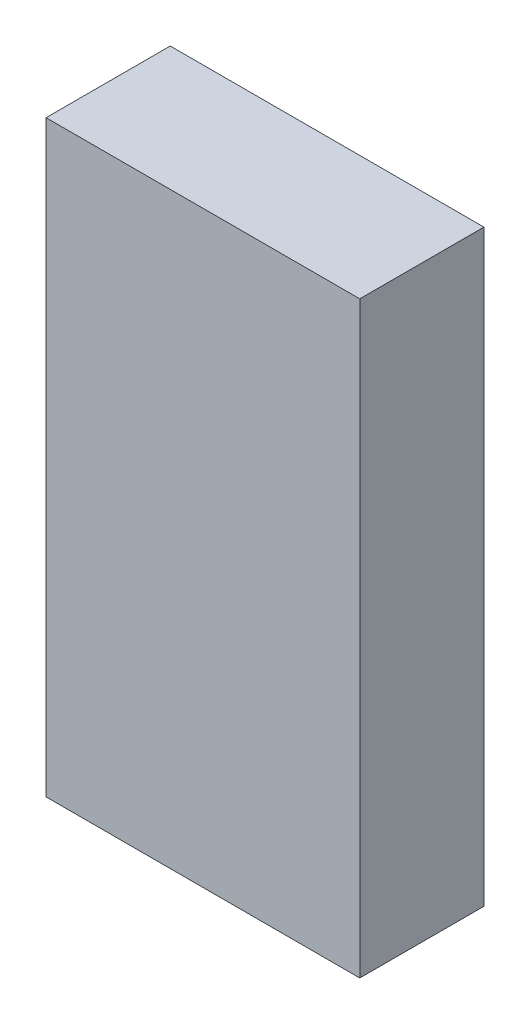
ISO-10303-21;
HEADER;
FILE_DESCRIPTION(('STEP AP214'),'2;1');
FILE_NAME('part.step','',(''),(''),'','','');
FILE_SCHEMA(('AUTOMOTIVE_DESIGN { 1 0 10303 214 1 1 1 1 }'));
ENDSEC;
DATA;
#1=APPLICATION_CONTEXT('core data for automotive mechanical design processes');
#2=APPLICATION_PROTOCOL_DEFINITION('international standard','automotive_design',2000,#1);
#3=PRODUCT_CONTEXT('',#1,'mechanical');
#4=PRODUCT('Part','Part','',(#3));
#5=PRODUCT_RELATED_PRODUCT_CATEGORY('part','',(#4));
#6=PRODUCT_DEFINITION_FORMATION('','',#4);
#7=PRODUCT_DEFINITION_CONTEXT('part definition',#1,'design');
#8=PRODUCT_DEFINITION('design','',#6,#7);
#9=PRODUCT_DEFINITION_SHAPE('','',#8);
#10=(LENGTH_UNIT() NAMED_UNIT(*) SI_UNIT(.MILLI.,.METRE.));
#11=(NAMED_UNIT(*) PLANE_ANGLE_UNIT() SI_UNIT($,.RADIAN.));
#12=(NAMED_UNIT(*) SI_UNIT($,.STERADIAN.) SOLID_ANGLE_UNIT());
#13=UNCERTAINTY_MEASURE_WITH_UNIT(LENGTH_MEASURE(1.E-05),#10,'distance_accuracy_value','');
#14=(GEOMETRIC_REPRESENTATION_CONTEXT(3) GLOBAL_UNCERTAINTY_ASSIGNED_CONTEXT((#13)) GLOBAL_UNIT_ASSIGNED_CONTEXT((#10,
#11,#12)) REPRESENTATION_CONTEXT('',''));
#15=CARTESIAN_POINT('',(0.,0.,0.));
#16=DIRECTION('',(0.,0.,1.));
#17=DIRECTION('',(1.,0.,0.));
#18=AXIS2_PLACEMENT_3D('',#15,#16,#17);
#19=CARTESIAN_POINT('',(0.6096,1.143,0.4826));
#20=DIRECTION('',(0.,0.,-1.));
#21=DIRECTION('',(0.,-1.,0.));
#22=AXIS2_PLACEMENT_3D('',#19,#20,#21);
#23=PLANE('',#22);
#24=DIRECTION('',(-1.,0.,0.));
#25=VECTOR('',#24,1.);
#26=CARTESIAN_POINT('',(0.6096,1.143,0.4826));
#27=LINE('',#26,#25);
#28=CARTESIAN_POINT('',(0.6096,1.143,0.4826));
#29=VERTEX_POINT('',#28);
#30=CARTESIAN_POINT('',(-0.6096,1.143,0.4826));
#31=VERTEX_POINT('',#30);
#32=EDGE_CURVE('E86',#29,#31,#27,.T.);
#33=ORIENTED_EDGE('',*,*,#32,.T.);
#34=DIRECTION('',(0.,-1.,0.));
#35=VECTOR('',#34,1.);
#36=CARTESIAN_POINT('',(-0.6096,1.143,0.4826));
#37=LINE('',#36,#35);
#38=CARTESIAN_POINT('',(-0.6096,-1.143,0.4826));
#39=VERTEX_POINT('',#38);
#40=EDGE_CURVE('E19',#31,#39,#37,.T.);
#41=ORIENTED_EDGE('',*,*,#40,.T.);
#42=DIRECTION('',(1.,0.,0.));
#43=VECTOR('',#42,1.);
#44=CARTESIAN_POINT('',(-0.6096,-1.143,0.4826));
#45=LINE('',#44,#43);
#46=CARTESIAN_POINT('',(0.6096,-1.143,0.4826));
#47=VERTEX_POINT('',#46);
#48=EDGE_CURVE('E102',#39,#47,#45,.T.);
#49=ORIENTED_EDGE('',*,*,#48,.T.);
#50=DIRECTION('',(0.,1.,0.));
#51=VECTOR('',#50,1.);
#52=CARTESIAN_POINT('',(0.6096,-1.143,0.4826));
#53=LINE('',#52,#51);
#54=EDGE_CURVE('E11',#47,#29,#53,.T.);
#55=ORIENTED_EDGE('',*,*,#54,.T.);
#56=EDGE_LOOP('',(#33,#41,#49,#55));
#57=FACE_BOUND('',#56,.T.);
#58=ADVANCED_FACE('F16',(#57),#23,.F.);
#59=CARTESIAN_POINT('',(0.6096,1.143,0.));
#60=DIRECTION('',(0.,0.,-1.));
#61=DIRECTION('',(0.,-1.,0.));
#62=AXIS2_PLACEMENT_3D('',#59,#60,#61);
#63=PLANE('',#62);
#64=DIRECTION('',(0.,1.,0.));
#65=VECTOR('',#64,1.);
#66=CARTESIAN_POINT('',(0.6096,-1.143,0.));
#67=LINE('',#66,#65);
#68=CARTESIAN_POINT('',(0.6096,-1.143,0.));
#69=VERTEX_POINT('',#68);
#70=CARTESIAN_POINT('',(0.6096,1.143,0.));
#71=VERTEX_POINT('',#70);
#72=EDGE_CURVE('E26',#69,#71,#67,.T.);
#73=ORIENTED_EDGE('',*,*,#72,.F.);
#74=DIRECTION('',(1.,0.,0.));
#75=VECTOR('',#74,1.);
#76=CARTESIAN_POINT('',(-0.6096,-1.143,0.));
#77=LINE('',#76,#75);
#78=CARTESIAN_POINT('',(-0.6096,-1.143,0.));
#79=VERTEX_POINT('',#78);
#80=EDGE_CURVE('E70',#79,#69,#77,.T.);
#81=ORIENTED_EDGE('',*,*,#80,.F.);
#82=DIRECTION('',(0.,-1.,0.));
#83=VECTOR('',#82,1.);
#84=CARTESIAN_POINT('',(-0.6096,1.143,0.));
#85=LINE('',#84,#83);
#86=CARTESIAN_POINT('',(-0.6096,1.143,0.));
#87=VERTEX_POINT('',#86);
#88=EDGE_CURVE('E64',#87,#79,#85,.T.);
#89=ORIENTED_EDGE('',*,*,#88,.F.);
#90=DIRECTION('',(-1.,0.,0.));
#91=VECTOR('',#90,1.);
#92=CARTESIAN_POINT('',(0.6096,1.143,0.));
#93=LINE('',#92,#91);
#94=EDGE_CURVE('E68',#71,#87,#93,.T.);
#95=ORIENTED_EDGE('',*,*,#94,.F.);
#96=EDGE_LOOP('',(#73,#81,#89,#95));
#97=FACE_BOUND('',#96,.T.);
#98=ADVANCED_FACE('F66',(#97),#63,.T.);
#99=CARTESIAN_POINT('',(0.6096,-1.143,0.));
#100=DIRECTION('',(-1.,0.,0.));
#101=DIRECTION('',(0.,0.,1.));
#102=AXIS2_PLACEMENT_3D('',#99,#100,#101);
#103=PLANE('',#102);
#104=ORIENTED_EDGE('',*,*,#72,.T.);
#105=DIRECTION('',(0.,0.,1.));
#106=VECTOR('',#105,1.);
#107=CARTESIAN_POINT('',(0.6096,1.143,0.));
#108=LINE('',#107,#106);
#109=EDGE_CURVE('E76',#71,#29,#108,.T.);
#110=ORIENTED_EDGE('',*,*,#109,.T.);
#111=ORIENTED_EDGE('',*,*,#54,.F.);
#112=DIRECTION('',(0.,0.,1.));
#113=VECTOR('',#112,1.);
#114=CARTESIAN_POINT('',(0.6096,-1.143,0.));
#115=LINE('',#114,#113);
#116=EDGE_CURVE('E97',#69,#47,#115,.T.);
#117=ORIENTED_EDGE('',*,*,#116,.F.);
#118=EDGE_LOOP('',(#104,#110,#111,#117));
#119=FACE_BOUND('',#118,.T.);
#120=ADVANCED_FACE('F116',(#119),#103,.F.);
#121=CARTESIAN_POINT('',(-0.6096,-1.143,0.));
#122=DIRECTION('',(0.,1.,0.));
#123=DIRECTION('',(1.,0.,0.));
#124=AXIS2_PLACEMENT_3D('',#121,#122,#123);
#125=PLANE('',#124);
#126=ORIENTED_EDGE('',*,*,#80,.T.);
#127=ORIENTED_EDGE('',*,*,#116,.T.);
#128=ORIENTED_EDGE('',*,*,#48,.F.);
#129=DIRECTION('',(0.,0.,1.));
#130=VECTOR('',#129,1.);
#131=CARTESIAN_POINT('',(-0.6096,-1.143,0.));
#132=LINE('',#131,#130);
#133=EDGE_CURVE('E75',#79,#39,#132,.T.);
#134=ORIENTED_EDGE('',*,*,#133,.F.);
#135=EDGE_LOOP('',(#126,#127,#128,#134));
#136=FACE_BOUND('',#135,.T.);
#137=ADVANCED_FACE('F115',(#136),#125,.F.);
#138=CARTESIAN_POINT('',(-0.6096,1.143,0.));
#139=DIRECTION('',(1.,0.,0.));
#140=DIRECTION('',(0.,1.,0.));
#141=AXIS2_PLACEMENT_3D('',#138,#139,#140);
#142=PLANE('',#141);
#143=ORIENTED_EDGE('',*,*,#88,.T.);
#144=ORIENTED_EDGE('',*,*,#133,.T.);
#145=ORIENTED_EDGE('',*,*,#40,.F.);
#146=DIRECTION('',(0.,0.,1.));
#147=VECTOR('',#146,1.);
#148=CARTESIAN_POINT('',(-0.6096,1.143,0.));
#149=LINE('',#148,#147);
#150=EDGE_CURVE('E79',#87,#31,#149,.T.);
#151=ORIENTED_EDGE('',*,*,#150,.F.);
#152=EDGE_LOOP('',(#143,#144,#145,#151));
#153=FACE_BOUND('',#152,.T.);
#154=ADVANCED_FACE('F80',(#153),#142,.F.);
#155=CARTESIAN_POINT('',(0.6096,1.143,0.));
#156=DIRECTION('',(0.,-1.,0.));
#157=DIRECTION('',(0.,0.,-1.));
#158=AXIS2_PLACEMENT_3D('',#155,#156,#157);
#159=PLANE('',#158);
#160=ORIENTED_EDGE('',*,*,#94,.T.);
#161=ORIENTED_EDGE('',*,*,#150,.T.);
#162=ORIENTED_EDGE('',*,*,#32,.F.);
#163=ORIENTED_EDGE('',*,*,#109,.F.);
#164=EDGE_LOOP('',(#160,#161,#162,#163));
#165=FACE_BOUND('',#164,.T.);
#166=ADVANCED_FACE('F89',(#165),#159,.F.);
#167=CLOSED_SHELL('',(#58,#98,#120,#137,#154,#166));
#168=MANIFOLD_SOLID_BREP('B1',#167);
#169=ADVANCED_BREP_SHAPE_REPRESENTATION('',(#18,#168),#14);
#170=SHAPE_DEFINITION_REPRESENTATION(#9,#169);
ENDSEC;
END-ISO-10303-21;
